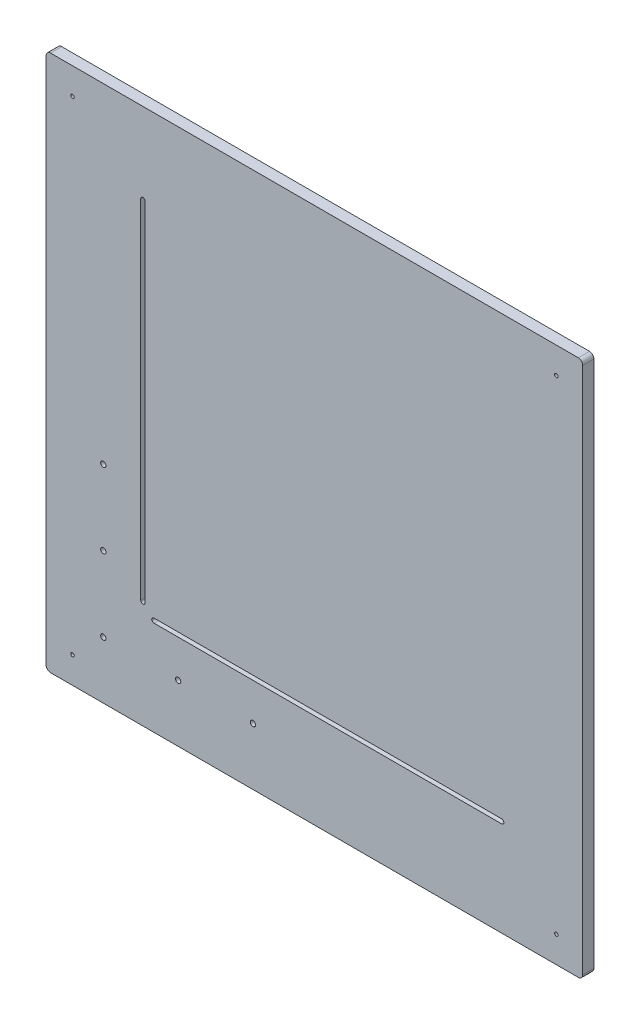
ISO-10303-21;
HEADER;
FILE_DESCRIPTION(('STEP AP214'),'2;1');
FILE_NAME('part.step','',(''),(''),'','','');
FILE_SCHEMA(('AUTOMOTIVE_DESIGN { 1 0 10303 214 1 1 1 1 }'));
ENDSEC;
DATA;
#1=APPLICATION_CONTEXT('core data for automotive mechanical design processes');
#2=APPLICATION_PROTOCOL_DEFINITION('international standard','automotive_design',2000,#1);
#3=PRODUCT_CONTEXT('',#1,'mechanical');
#4=PRODUCT('Part','Part','',(#3));
#5=PRODUCT_RELATED_PRODUCT_CATEGORY('part','',(#4));
#6=PRODUCT_DEFINITION_FORMATION('','',#4);
#7=PRODUCT_DEFINITION_CONTEXT('part definition',#1,'design');
#8=PRODUCT_DEFINITION('design','',#6,#7);
#9=PRODUCT_DEFINITION_SHAPE('','',#8);
#10=(LENGTH_UNIT() NAMED_UNIT(*) SI_UNIT(.MILLI.,.METRE.));
#11=(NAMED_UNIT(*) PLANE_ANGLE_UNIT() SI_UNIT($,.RADIAN.));
#12=(NAMED_UNIT(*) SI_UNIT($,.STERADIAN.) SOLID_ANGLE_UNIT());
#13=UNCERTAINTY_MEASURE_WITH_UNIT(LENGTH_MEASURE(1.E-05),#10,'distance_accuracy_value','');
#14=(GEOMETRIC_REPRESENTATION_CONTEXT(3) GLOBAL_UNCERTAINTY_ASSIGNED_CONTEXT((#13)) GLOBAL_UNIT_ASSIGNED_CONTEXT((#10,
#11,#12)) REPRESENTATION_CONTEXT('',''));
#15=CARTESIAN_POINT('',(0.,0.,0.));
#16=DIRECTION('',(0.,0.,1.));
#17=DIRECTION('',(1.,0.,0.));
#18=AXIS2_PLACEMENT_3D('',#15,#16,#17);
#19=CARTESIAN_POINT('',(0.,0.,0.));
#20=DIRECTION('',(0.,0.,-1.));
#21=DIRECTION('',(-1.,0.,0.));
#22=AXIS2_PLACEMENT_3D('',#19,#20,#21);
#23=PLANE('',#22);
#24=CARTESIAN_POINT('',(-34.9,-119.9,0.));
#25=DIRECTION('',(0.,0.,1.));
#26=DIRECTION('',(1.,0.,0.));
#27=AXIS2_PLACEMENT_3D('',#24,#25,#26);
#28=CIRCLE('',#27,1.5);
#29=CARTESIAN_POINT('',(-33.4,-119.9,0.));
#30=VERTEX_POINT('',#29);
#31=EDGE_CURVE('E746',#30,#30,#28,.T.);
#32=ORIENTED_EDGE('',*,*,#31,.T.);
#33=EDGE_LOOP('',(#32));
#34=FACE_BOUND('',#33,.T.);
#35=CARTESIAN_POINT('',(-77.4,-119.9,0.));
#36=DIRECTION('',(0.,0.,1.));
#37=DIRECTION('',(1.,0.,0.));
#38=AXIS2_PLACEMENT_3D('',#35,#36,#37);
#39=CIRCLE('',#38,1.5);
#40=CARTESIAN_POINT('',(-75.9,-119.9,0.));
#41=VERTEX_POINT('',#40);
#42=EDGE_CURVE('E756',#41,#41,#39,.T.);
#43=ORIENTED_EDGE('',*,*,#42,.T.);
#44=EDGE_LOOP('',(#43));
#45=FACE_BOUND('',#44,.T.);
#46=CARTESIAN_POINT('',(-119.9,-119.9,0.));
#47=DIRECTION('',(0.,0.,1.));
#48=DIRECTION('',(1.,0.,0.));
#49=AXIS2_PLACEMENT_3D('',#46,#47,#48);
#50=CIRCLE('',#49,1.5);
#51=CARTESIAN_POINT('',(-118.4,-119.9,0.));
#52=VERTEX_POINT('',#51);
#53=EDGE_CURVE('E762',#52,#52,#50,.T.);
#54=ORIENTED_EDGE('',*,*,#53,.T.);
#55=EDGE_LOOP('',(#54));
#56=FACE_BOUND('',#55,.T.);
#57=CARTESIAN_POINT('',(-119.9,-77.4,0.));
#58=DIRECTION('',(0.,0.,1.));
#59=DIRECTION('',(1.,0.,0.));
#60=AXIS2_PLACEMENT_3D('',#57,#58,#59);
#61=CIRCLE('',#60,1.5);
#62=CARTESIAN_POINT('',(-118.4,-77.4,0.));
#63=VERTEX_POINT('',#62);
#64=EDGE_CURVE('E768',#63,#63,#61,.T.);
#65=ORIENTED_EDGE('',*,*,#64,.T.);
#66=EDGE_LOOP('',(#65));
#67=FACE_BOUND('',#66,.T.);
#68=CARTESIAN_POINT('',(-119.9,-34.9,0.));
#69=DIRECTION('',(0.,0.,1.));
#70=DIRECTION('',(1.,0.,0.));
#71=AXIS2_PLACEMENT_3D('',#68,#69,#70);
#72=CIRCLE('',#71,1.5);
#73=CARTESIAN_POINT('',(-118.4,-34.9,0.));
#74=VERTEX_POINT('',#73);
#75=EDGE_CURVE('E774',#74,#74,#72,.T.);
#76=ORIENTED_EDGE('',*,*,#75,.T.);
#77=EDGE_LOOP('',(#76));
#78=FACE_BOUND('',#77,.T.);
#79=CARTESIAN_POINT('',(137.4,137.4,0.));
#80=DIRECTION('',(0.,0.,-1.));
#81=DIRECTION('',(-1.,0.,0.));
#82=AXIS2_PLACEMENT_3D('',#79,#80,#81);
#83=CIRCLE('',#82,1.);
#84=CARTESIAN_POINT('',(136.4,137.4,0.));
#85=VERTEX_POINT('',#84);
#86=EDGE_CURVE('E358',#85,#85,#83,.T.);
#87=ORIENTED_EDGE('',*,*,#86,.F.);
#88=EDGE_LOOP('',(#87));
#89=FACE_BOUND('',#88,.T.);
#90=CARTESIAN_POINT('',(-137.4,-137.4,0.));
#91=DIRECTION('',(0.,0.,-1.));
#92=DIRECTION('',(-1.,0.,0.));
#93=AXIS2_PLACEMENT_3D('',#90,#91,#92);
#94=CIRCLE('',#93,1.);
#95=CARTESIAN_POINT('',(-138.4,-137.4,0.));
#96=VERTEX_POINT('',#95);
#97=EDGE_CURVE('E364',#96,#96,#94,.T.);
#98=ORIENTED_EDGE('',*,*,#97,.F.);
#99=EDGE_LOOP('',(#98));
#100=FACE_BOUND('',#99,.T.);
#101=CARTESIAN_POINT('',(137.4,-137.4,0.));
#102=DIRECTION('',(0.,0.,-1.));
#103=DIRECTION('',(-1.,0.,0.));
#104=AXIS2_PLACEMENT_3D('',#101,#102,#103);
#105=CIRCLE('',#104,1.);
#106=CARTESIAN_POINT('',(136.4,-137.4,0.));
#107=VERTEX_POINT('',#106);
#108=EDGE_CURVE('E370',#107,#107,#105,.T.);
#109=ORIENTED_EDGE('',*,*,#108,.F.);
#110=EDGE_LOOP('',(#109));
#111=FACE_BOUND('',#110,.T.);
#112=CARTESIAN_POINT('',(-137.4,137.4,0.));
#113=DIRECTION('',(0.,0.,-1.));
#114=DIRECTION('',(-1.,0.,0.));
#115=AXIS2_PLACEMENT_3D('',#112,#113,#114);
#116=CIRCLE('',#115,1.);
#117=CARTESIAN_POINT('',(-138.4,137.4,0.));
#118=VERTEX_POINT('',#117);
#119=EDGE_CURVE('E376',#118,#118,#116,.T.);
#120=ORIENTED_EDGE('',*,*,#119,.F.);
#121=EDGE_LOOP('',(#120));
#122=FACE_BOUND('',#121,.T.);
#123=DIRECTION('',(-1.,0.,0.));
#124=VECTOR('',#123,1.);
#125=CARTESIAN_POINT('',(-152.4,152.4,0.));
#126=LINE('',#125,#124);
#127=CARTESIAN_POINT('',(149.9,152.4,0.));
#128=VERTEX_POINT('',#127);
#129=CARTESIAN_POINT('',(-149.9,152.4,0.));
#130=VERTEX_POINT('',#129);
#131=EDGE_CURVE('E396',#128,#130,#126,.T.);
#132=ORIENTED_EDGE('',*,*,#131,.F.);
#133=CARTESIAN_POINT('',(149.9,149.9,0.));
#134=DIRECTION('',(0.,0.,-1.));
#135=DIRECTION('',(-1.,0.,0.));
#136=AXIS2_PLACEMENT_3D('',#133,#134,#135);
#137=CIRCLE('',#136,2.5);
#138=CARTESIAN_POINT('',(152.4,149.9,0.));
#139=VERTEX_POINT('',#138);
#140=EDGE_CURVE('E414',#128,#139,#137,.T.);
#141=ORIENTED_EDGE('',*,*,#140,.T.);
#142=DIRECTION('',(0.,1.,0.));
#143=VECTOR('',#142,1.);
#144=CARTESIAN_POINT('',(152.4,-152.4,0.));
#145=LINE('',#144,#143);
#146=CARTESIAN_POINT('',(152.4,-149.9,0.));
#147=VERTEX_POINT('',#146);
#148=EDGE_CURVE('E379',#147,#139,#145,.T.);
#149=ORIENTED_EDGE('',*,*,#148,.F.);
#150=CARTESIAN_POINT('',(149.9,-149.9,0.));
#151=DIRECTION('',(0.,0.,-1.));
#152=DIRECTION('',(-1.,0.,0.));
#153=AXIS2_PLACEMENT_3D('',#150,#151,#152);
#154=CIRCLE('',#153,2.5);
#155=CARTESIAN_POINT('',(149.9,-152.4,0.));
#156=VERTEX_POINT('',#155);
#157=EDGE_CURVE('E412',#147,#156,#154,.T.);
#158=ORIENTED_EDGE('',*,*,#157,.T.);
#159=DIRECTION('',(1.,0.,0.));
#160=VECTOR('',#159,1.);
#161=CARTESIAN_POINT('',(-152.4,-152.4,0.));
#162=LINE('',#161,#160);
#163=CARTESIAN_POINT('',(-149.9,-152.4,0.));
#164=VERTEX_POINT('',#163);
#165=EDGE_CURVE('E384',#164,#156,#162,.T.);
#166=ORIENTED_EDGE('',*,*,#165,.F.);
#167=CARTESIAN_POINT('',(-149.9,-149.9,0.));
#168=DIRECTION('',(0.,0.,-1.));
#169=DIRECTION('',(-1.,0.,0.));
#170=AXIS2_PLACEMENT_3D('',#167,#168,#169);
#171=CIRCLE('',#170,2.5);
#172=CARTESIAN_POINT('',(-152.4,-149.9,0.));
#173=VERTEX_POINT('',#172);
#174=EDGE_CURVE('E410',#164,#173,#171,.T.);
#175=ORIENTED_EDGE('',*,*,#174,.T.);
#176=DIRECTION('',(0.,-1.,0.));
#177=VECTOR('',#176,1.);
#178=CARTESIAN_POINT('',(-152.4,-152.4,0.));
#179=LINE('',#178,#177);
#180=CARTESIAN_POINT('',(-152.4,149.9,0.));
#181=VERTEX_POINT('',#180);
#182=EDGE_CURVE('E399',#181,#173,#179,.T.);
#183=ORIENTED_EDGE('',*,*,#182,.F.);
#184=CARTESIAN_POINT('',(-149.9,149.9,0.));
#185=DIRECTION('',(0.,0.,-1.));
#186=DIRECTION('',(-1.,0.,0.));
#187=AXIS2_PLACEMENT_3D('',#184,#185,#186);
#188=CIRCLE('',#187,2.5);
#189=EDGE_CURVE('E408',#181,#130,#188,.T.);
#190=ORIENTED_EDGE('',*,*,#189,.T.);
#191=EDGE_LOOP('',(#132,#141,#149,#158,#166,#175,#183,#190));
#192=FACE_BOUND('',#191,.T.);
#193=CARTESIAN_POINT('',(-91.15,-97.4,0.));
#194=DIRECTION('',(0.,0.,1.));
#195=DIRECTION('',(1.,0.,0.));
#196=AXIS2_PLACEMENT_3D('',#193,#194,#195);
#197=CIRCLE('',#196,1.25);
#198=CARTESIAN_POINT('',(-91.1499999999999,-96.15,0.));
#199=VERTEX_POINT('',#198);
#200=CARTESIAN_POINT('',(-91.1499999999999,-98.65,0.));
#201=VERTEX_POINT('',#200);
#202=EDGE_CURVE('E336',#199,#201,#197,.T.);
#203=ORIENTED_EDGE('',*,*,#202,.T.);
#204=DIRECTION('',(1.,0.,0.));
#205=VECTOR('',#204,1.);
#206=CARTESIAN_POINT('',(-91.1499999999999,-98.65,0.));
#207=LINE('',#206,#205);
#208=CARTESIAN_POINT('',(106.35,-98.65,0.));
#209=VERTEX_POINT('',#208);
#210=EDGE_CURVE('E325',#201,#209,#207,.T.);
#211=ORIENTED_EDGE('',*,*,#210,.T.);
#212=CARTESIAN_POINT('',(106.35,-97.4,0.));
#213=DIRECTION('',(0.,0.,1.));
#214=DIRECTION('',(1.,0.,0.));
#215=AXIS2_PLACEMENT_3D('',#212,#213,#214);
#216=CIRCLE('',#215,1.25);
#217=CARTESIAN_POINT('',(106.35,-96.15,0.));
#218=VERTEX_POINT('',#217);
#219=EDGE_CURVE('E347',#209,#218,#216,.T.);
#220=ORIENTED_EDGE('',*,*,#219,.T.);
#221=DIRECTION('',(1.,0.,0.));
#222=VECTOR('',#221,1.);
#223=CARTESIAN_POINT('',(-91.1499999999999,-96.15,0.));
#224=LINE('',#223,#222);
#225=EDGE_CURVE('E328',#199,#218,#224,.T.);
#226=ORIENTED_EDGE('',*,*,#225,.F.);
#227=EDGE_LOOP('',(#203,#211,#220,#226));
#228=FACE_BOUND('',#227,.T.);
#229=CARTESIAN_POINT('',(-97.4,106.35,0.));
#230=DIRECTION('',(0.,0.,1.));
#231=DIRECTION('',(1.,0.,0.));
#232=AXIS2_PLACEMENT_3D('',#229,#230,#231);
#233=CIRCLE('',#232,1.25);
#234=CARTESIAN_POINT('',(-96.15,106.35,0.));
#235=VERTEX_POINT('',#234);
#236=CARTESIAN_POINT('',(-98.65,106.35,0.));
#237=VERTEX_POINT('',#236);
#238=EDGE_CURVE('E306',#235,#237,#233,.T.);
#239=ORIENTED_EDGE('',*,*,#238,.T.);
#240=DIRECTION('',(0.,-1.,0.));
#241=VECTOR('',#240,1.);
#242=CARTESIAN_POINT('',(-98.65,106.35,0.));
#243=LINE('',#242,#241);
#244=CARTESIAN_POINT('',(-98.65,-91.15,0.));
#245=VERTEX_POINT('',#244);
#246=EDGE_CURVE('E292',#237,#245,#243,.T.);
#247=ORIENTED_EDGE('',*,*,#246,.T.);
#248=CARTESIAN_POINT('',(-97.4,-91.15,0.));
#249=DIRECTION('',(0.,0.,1.));
#250=DIRECTION('',(1.,0.,0.));
#251=AXIS2_PLACEMENT_3D('',#248,#249,#250);
#252=CIRCLE('',#251,1.25);
#253=CARTESIAN_POINT('',(-96.15,-91.15,0.));
#254=VERTEX_POINT('',#253);
#255=EDGE_CURVE('E320',#245,#254,#252,.T.);
#256=ORIENTED_EDGE('',*,*,#255,.T.);
#257=DIRECTION('',(0.,-1.,0.));
#258=VECTOR('',#257,1.);
#259=CARTESIAN_POINT('',(-96.15,106.35,0.));
#260=LINE('',#259,#258);
#261=EDGE_CURVE('E302',#235,#254,#260,.T.);
#262=ORIENTED_EDGE('',*,*,#261,.F.);
#263=EDGE_LOOP('',(#239,#247,#256,#262));
#264=FACE_BOUND('',#263,.T.);
#265=ADVANCED_FACE('F182',(#34,#45,#56,#67,#78,#89,#100,#111,#122,#192,#228,#264),#23,.T.);
#266=CARTESIAN_POINT('',(0.,0.,6.35));
#267=DIRECTION('',(0.,0.,-1.));
#268=DIRECTION('',(-1.,0.,0.));
#269=AXIS2_PLACEMENT_3D('',#266,#267,#268);
#270=PLANE('',#269);
#271=CARTESIAN_POINT('',(-34.9,-119.9,6.35));
#272=DIRECTION('',(0.,0.,1.));
#273=DIRECTION('',(1.,0.,0.));
#274=AXIS2_PLACEMENT_3D('',#271,#272,#273);
#275=CIRCLE('',#274,1.5);
#276=CARTESIAN_POINT('',(-33.4,-119.9,6.35));
#277=VERTEX_POINT('',#276);
#278=EDGE_CURVE('E749',#277,#277,#275,.T.);
#279=ORIENTED_EDGE('',*,*,#278,.F.);
#280=EDGE_LOOP('',(#279));
#281=FACE_BOUND('',#280,.T.);
#282=CARTESIAN_POINT('',(-77.4,-119.9,6.35));
#283=DIRECTION('',(0.,0.,1.));
#284=DIRECTION('',(1.,0.,0.));
#285=AXIS2_PLACEMENT_3D('',#282,#283,#284);
#286=CIRCLE('',#285,1.5);
#287=CARTESIAN_POINT('',(-75.9,-119.9,6.35));
#288=VERTEX_POINT('',#287);
#289=EDGE_CURVE('E751',#288,#288,#286,.T.);
#290=ORIENTED_EDGE('',*,*,#289,.F.);
#291=EDGE_LOOP('',(#290));
#292=FACE_BOUND('',#291,.T.);
#293=CARTESIAN_POINT('',(-119.9,-119.9,6.35));
#294=DIRECTION('',(0.,0.,1.));
#295=DIRECTION('',(1.,0.,0.));
#296=AXIS2_PLACEMENT_3D('',#293,#294,#295);
#297=CIRCLE('',#296,1.5);
#298=CARTESIAN_POINT('',(-118.4,-119.9,6.35));
#299=VERTEX_POINT('',#298);
#300=EDGE_CURVE('E759',#299,#299,#297,.T.);
#301=ORIENTED_EDGE('',*,*,#300,.F.);
#302=EDGE_LOOP('',(#301));
#303=FACE_BOUND('',#302,.T.);
#304=CARTESIAN_POINT('',(-119.9,-77.4,6.35));
#305=DIRECTION('',(0.,0.,1.));
#306=DIRECTION('',(1.,0.,0.));
#307=AXIS2_PLACEMENT_3D('',#304,#305,#306);
#308=CIRCLE('',#307,1.5);
#309=CARTESIAN_POINT('',(-118.4,-77.4,6.35));
#310=VERTEX_POINT('',#309);
#311=EDGE_CURVE('E765',#310,#310,#308,.T.);
#312=ORIENTED_EDGE('',*,*,#311,.F.);
#313=EDGE_LOOP('',(#312));
#314=FACE_BOUND('',#313,.T.);
#315=CARTESIAN_POINT('',(-119.9,-34.9,6.35));
#316=DIRECTION('',(0.,0.,1.));
#317=DIRECTION('',(1.,0.,0.));
#318=AXIS2_PLACEMENT_3D('',#315,#316,#317);
#319=CIRCLE('',#318,1.5);
#320=CARTESIAN_POINT('',(-118.4,-34.9,6.35));
#321=VERTEX_POINT('',#320);
#322=EDGE_CURVE('E771',#321,#321,#319,.T.);
#323=ORIENTED_EDGE('',*,*,#322,.F.);
#324=EDGE_LOOP('',(#323));
#325=FACE_BOUND('',#324,.T.);
#326=CARTESIAN_POINT('',(-97.4,-91.15,6.35));
#327=DIRECTION('',(0.,0.,1.));
#328=DIRECTION('',(1.,0.,0.));
#329=AXIS2_PLACEMENT_3D('',#326,#327,#328);
#330=CIRCLE('',#329,1.25);
#331=CARTESIAN_POINT('',(-98.65,-91.15,6.35));
#332=VERTEX_POINT('',#331);
#333=CARTESIAN_POINT('',(-96.15,-91.15,6.35));
#334=VERTEX_POINT('',#333);
#335=EDGE_CURVE('E318',#332,#334,#330,.T.);
#336=ORIENTED_EDGE('',*,*,#335,.F.);
#337=DIRECTION('',(0.,-1.,0.));
#338=VECTOR('',#337,1.);
#339=CARTESIAN_POINT('',(-98.65,106.35,6.35));
#340=LINE('',#339,#338);
#341=CARTESIAN_POINT('',(-98.65,106.35,6.35));
#342=VERTEX_POINT('',#341);
#343=EDGE_CURVE('E303',#342,#332,#340,.T.);
#344=ORIENTED_EDGE('',*,*,#343,.F.);
#345=CARTESIAN_POINT('',(-97.4,106.35,6.35));
#346=DIRECTION('',(0.,0.,1.));
#347=DIRECTION('',(1.,0.,0.));
#348=AXIS2_PLACEMENT_3D('',#345,#346,#347);
#349=CIRCLE('',#348,1.25);
#350=CARTESIAN_POINT('',(-96.15,106.35,6.35));
#351=VERTEX_POINT('',#350);
#352=EDGE_CURVE('E309',#351,#342,#349,.T.);
#353=ORIENTED_EDGE('',*,*,#352,.F.);
#354=DIRECTION('',(0.,-1.,0.));
#355=VECTOR('',#354,1.);
#356=CARTESIAN_POINT('',(-96.15,106.35,6.35));
#357=LINE('',#356,#355);
#358=EDGE_CURVE('E779',#351,#334,#357,.T.);
#359=ORIENTED_EDGE('',*,*,#358,.T.);
#360=EDGE_LOOP('',(#336,#344,#353,#359));
#361=FACE_BOUND('',#360,.T.);
#362=CARTESIAN_POINT('',(106.35,-97.4,6.35));
#363=DIRECTION('',(0.,0.,1.));
#364=DIRECTION('',(1.,0.,0.));
#365=AXIS2_PLACEMENT_3D('',#362,#363,#364);
#366=CIRCLE('',#365,1.25);
#367=CARTESIAN_POINT('',(106.35,-98.65,6.35));
#368=VERTEX_POINT('',#367);
#369=CARTESIAN_POINT('',(106.35,-96.15,6.35));
#370=VERTEX_POINT('',#369);
#371=EDGE_CURVE('E344',#368,#370,#366,.T.);
#372=ORIENTED_EDGE('',*,*,#371,.F.);
#373=DIRECTION('',(1.,0.,0.));
#374=VECTOR('',#373,1.);
#375=CARTESIAN_POINT('',(-91.1499999999999,-98.65,6.35));
#376=LINE('',#375,#374);
#377=CARTESIAN_POINT('',(-91.15,-98.65,6.35));
#378=VERTEX_POINT('',#377);
#379=EDGE_CURVE('E323',#378,#368,#376,.T.);
#380=ORIENTED_EDGE('',*,*,#379,.F.);
#381=CARTESIAN_POINT('',(-91.15,-97.4,6.35));
#382=DIRECTION('',(0.,0.,1.));
#383=DIRECTION('',(1.,0.,0.));
#384=AXIS2_PLACEMENT_3D('',#381,#382,#383);
#385=CIRCLE('',#384,1.25);
#386=CARTESIAN_POINT('',(-91.1499999999999,-96.15,6.35));
#387=VERTEX_POINT('',#386);
#388=EDGE_CURVE('E333',#387,#378,#385,.T.);
#389=ORIENTED_EDGE('',*,*,#388,.F.);
#390=DIRECTION('',(1.,0.,0.));
#391=VECTOR('',#390,1.);
#392=CARTESIAN_POINT('',(-91.1499999999999,-96.15,6.35));
#393=LINE('',#392,#391);
#394=EDGE_CURVE('E330',#387,#370,#393,.T.);
#395=ORIENTED_EDGE('',*,*,#394,.T.);
#396=EDGE_LOOP('',(#372,#380,#389,#395));
#397=FACE_BOUND('',#396,.T.);
#398=CARTESIAN_POINT('',(-137.4,-137.4,6.35));
#399=DIRECTION('',(0.,0.,1.));
#400=DIRECTION('',(1.,0.,0.));
#401=AXIS2_PLACEMENT_3D('',#398,#399,#400);
#402=CIRCLE('',#401,1.);
#403=CARTESIAN_POINT('',(-136.4,-137.4,6.35));
#404=VERTEX_POINT('',#403);
#405=EDGE_CURVE('E361',#404,#404,#402,.T.);
#406=ORIENTED_EDGE('',*,*,#405,.F.);
#407=EDGE_LOOP('',(#406));
#408=FACE_BOUND('',#407,.T.);
#409=CARTESIAN_POINT('',(-137.4,137.4,6.35));
#410=DIRECTION('',(0.,0.,1.));
#411=DIRECTION('',(1.,0.,0.));
#412=AXIS2_PLACEMENT_3D('',#409,#410,#411);
#413=CIRCLE('',#412,1.);
#414=CARTESIAN_POINT('',(-136.4,137.4,6.35));
#415=VERTEX_POINT('',#414);
#416=EDGE_CURVE('E373',#415,#415,#413,.T.);
#417=ORIENTED_EDGE('',*,*,#416,.F.);
#418=EDGE_LOOP('',(#417));
#419=FACE_BOUND('',#418,.T.);
#420=DIRECTION('',(0.,1.,0.));
#421=VECTOR('',#420,1.);
#422=CARTESIAN_POINT('',(152.4,-152.4,6.35));
#423=LINE('',#422,#421);
#424=CARTESIAN_POINT('',(152.4,-149.9,6.35));
#425=VERTEX_POINT('',#424);
#426=CARTESIAN_POINT('',(152.4,149.9,6.35));
#427=VERTEX_POINT('',#426);
#428=EDGE_CURVE('E380',#425,#427,#423,.T.);
#429=ORIENTED_EDGE('',*,*,#428,.T.);
#430=CARTESIAN_POINT('',(149.9,149.9,6.35));
#431=DIRECTION('',(0.,0.,-1.));
#432=DIRECTION('',(-1.,0.,0.));
#433=AXIS2_PLACEMENT_3D('',#430,#431,#432);
#434=CIRCLE('',#433,2.5);
#435=CARTESIAN_POINT('',(149.9,152.4,6.35));
#436=VERTEX_POINT('',#435);
#437=EDGE_CURVE('E427',#427,#436,#434,.F.);
#438=ORIENTED_EDGE('',*,*,#437,.T.);
#439=DIRECTION('',(-1.,0.,0.));
#440=VECTOR('',#439,1.);
#441=CARTESIAN_POINT('',(-152.4,152.4,6.35));
#442=LINE('',#441,#440);
#443=CARTESIAN_POINT('',(-149.9,152.4,6.35));
#444=VERTEX_POINT('',#443);
#445=EDGE_CURVE('E383',#436,#444,#442,.T.);
#446=ORIENTED_EDGE('',*,*,#445,.T.);
#447=CARTESIAN_POINT('',(-149.9,149.9,6.35));
#448=DIRECTION('',(0.,0.,-1.));
#449=DIRECTION('',(-1.,0.,0.));
#450=AXIS2_PLACEMENT_3D('',#447,#448,#449);
#451=CIRCLE('',#450,2.5);
#452=CARTESIAN_POINT('',(-152.4,149.9,6.35));
#453=VERTEX_POINT('',#452);
#454=EDGE_CURVE('E421',#444,#453,#451,.F.);
#455=ORIENTED_EDGE('',*,*,#454,.T.);
#456=DIRECTION('',(0.,-1.,0.));
#457=VECTOR('',#456,1.);
#458=CARTESIAN_POINT('',(-152.4,-152.4,6.35));
#459=LINE('',#458,#457);
#460=CARTESIAN_POINT('',(-152.4,-149.9,6.35));
#461=VERTEX_POINT('',#460);
#462=EDGE_CURVE('E387',#453,#461,#459,.T.);
#463=ORIENTED_EDGE('',*,*,#462,.T.);
#464=CARTESIAN_POINT('',(-149.9,-149.9,6.35));
#465=DIRECTION('',(0.,0.,-1.));
#466=DIRECTION('',(-1.,0.,0.));
#467=AXIS2_PLACEMENT_3D('',#464,#465,#466);
#468=CIRCLE('',#467,2.5);
#469=CARTESIAN_POINT('',(-149.9,-152.4,6.35));
#470=VERTEX_POINT('',#469);
#471=EDGE_CURVE('E423',#461,#470,#468,.F.);
#472=ORIENTED_EDGE('',*,*,#471,.T.);
#473=DIRECTION('',(1.,0.,0.));
#474=VECTOR('',#473,1.);
#475=CARTESIAN_POINT('',(-152.4,-152.4,6.35));
#476=LINE('',#475,#474);
#477=CARTESIAN_POINT('',(149.9,-152.4,6.35));
#478=VERTEX_POINT('',#477);
#479=EDGE_CURVE('E390',#470,#478,#476,.T.);
#480=ORIENTED_EDGE('',*,*,#479,.T.);
#481=CARTESIAN_POINT('',(149.9,-149.9,6.35));
#482=DIRECTION('',(0.,0.,-1.));
#483=DIRECTION('',(-1.,0.,0.));
#484=AXIS2_PLACEMENT_3D('',#481,#482,#483);
#485=CIRCLE('',#484,2.5);
#486=EDGE_CURVE('E425',#478,#425,#485,.F.);
#487=ORIENTED_EDGE('',*,*,#486,.T.);
#488=EDGE_LOOP('',(#429,#438,#446,#455,#463,#472,#480,#487));
#489=FACE_BOUND('',#488,.T.);
#490=CARTESIAN_POINT('',(137.4,-137.4,6.35));
#491=DIRECTION('',(0.,0.,1.));
#492=DIRECTION('',(1.,0.,0.));
#493=AXIS2_PLACEMENT_3D('',#490,#491,#492);
#494=CIRCLE('',#493,1.);
#495=CARTESIAN_POINT('',(138.4,-137.4,6.35));
#496=VERTEX_POINT('',#495);
#497=EDGE_CURVE('E367',#496,#496,#494,.T.);
#498=ORIENTED_EDGE('',*,*,#497,.F.);
#499=EDGE_LOOP('',(#498));
#500=FACE_BOUND('',#499,.T.);
#501=CARTESIAN_POINT('',(137.4,137.4,6.35));
#502=DIRECTION('',(0.,0.,1.));
#503=DIRECTION('',(1.,0.,0.));
#504=AXIS2_PLACEMENT_3D('',#501,#502,#503);
#505=CIRCLE('',#504,1.);
#506=CARTESIAN_POINT('',(138.4,137.4,6.35));
#507=VERTEX_POINT('',#506);
#508=EDGE_CURVE('E355',#507,#507,#505,.T.);
#509=ORIENTED_EDGE('',*,*,#508,.F.);
#510=EDGE_LOOP('',(#509));
#511=FACE_BOUND('',#510,.T.);
#512=ADVANCED_FACE('F456',(#281,#292,#303,#314,#325,#361,#397,#408,#419,#489,#500,#511),#270,.F.);
#513=CARTESIAN_POINT('',(152.4,-152.4,6.35));
#514=DIRECTION('',(-1.,0.,0.));
#515=DIRECTION('',(0.,0.,1.));
#516=AXIS2_PLACEMENT_3D('',#513,#514,#515);
#517=PLANE('',#516);
#518=ORIENTED_EDGE('',*,*,#148,.T.);
#519=DIRECTION('',(0.,0.,-1.));
#520=VECTOR('',#519,1.);
#521=CARTESIAN_POINT('',(152.4,149.9,6.35));
#522=LINE('',#521,#520);
#523=EDGE_CURVE('E419',#139,#427,#522,.F.);
#524=ORIENTED_EDGE('',*,*,#523,.T.);
#525=ORIENTED_EDGE('',*,*,#428,.F.);
#526=DIRECTION('',(0.,0.,-1.));
#527=VECTOR('',#526,1.);
#528=CARTESIAN_POINT('',(152.4,-149.9,6.35));
#529=LINE('',#528,#527);
#530=EDGE_CURVE('E416',#425,#147,#529,.T.);
#531=ORIENTED_EDGE('',*,*,#530,.T.);
#532=EDGE_LOOP('',(#518,#524,#525,#531));
#533=FACE_BOUND('',#532,.T.);
#534=ADVANCED_FACE('F464',(#533),#517,.F.);
#535=CARTESIAN_POINT('',(-152.4,152.4,6.35));
#536=DIRECTION('',(0.,-1.,0.));
#537=DIRECTION('',(0.,0.,-1.));
#538=AXIS2_PLACEMENT_3D('',#535,#536,#537);
#539=PLANE('',#538);
#540=ORIENTED_EDGE('',*,*,#445,.F.);
#541=DIRECTION('',(0.,0.,-1.));
#542=VECTOR('',#541,1.);
#543=CARTESIAN_POINT('',(149.9,152.4,6.35));
#544=LINE('',#543,#542);
#545=EDGE_CURVE('E405',#436,#128,#544,.T.);
#546=ORIENTED_EDGE('',*,*,#545,.T.);
#547=ORIENTED_EDGE('',*,*,#131,.T.);
#548=DIRECTION('',(0.,0.,-1.));
#549=VECTOR('',#548,1.);
#550=CARTESIAN_POINT('',(-149.9,152.4,6.35));
#551=LINE('',#550,#549);
#552=EDGE_CURVE('E393',#130,#444,#551,.F.);
#553=ORIENTED_EDGE('',*,*,#552,.T.);
#554=EDGE_LOOP('',(#540,#546,#547,#553));
#555=FACE_BOUND('',#554,.T.);
#556=ADVANCED_FACE('F472',(#555),#539,.F.);
#557=CARTESIAN_POINT('',(-152.4,-152.4,6.35));
#558=DIRECTION('',(1.,0.,0.));
#559=DIRECTION('',(0.,0.,-1.));
#560=AXIS2_PLACEMENT_3D('',#557,#558,#559);
#561=PLANE('',#560);
#562=ORIENTED_EDGE('',*,*,#182,.T.);
#563=DIRECTION('',(0.,0.,-1.));
#564=VECTOR('',#563,1.);
#565=CARTESIAN_POINT('',(-152.4,-149.9,6.35));
#566=LINE('',#565,#564);
#567=EDGE_CURVE('E13',#173,#461,#566,.F.);
#568=ORIENTED_EDGE('',*,*,#567,.T.);
#569=ORIENTED_EDGE('',*,*,#462,.F.);
#570=DIRECTION('',(0.,0.,-1.));
#571=VECTOR('',#570,1.);
#572=CARTESIAN_POINT('',(-152.4,149.9,6.35));
#573=LINE('',#572,#571);
#574=EDGE_CURVE('E190',#453,#181,#573,.T.);
#575=ORIENTED_EDGE('',*,*,#574,.T.);
#576=EDGE_LOOP('',(#562,#568,#569,#575));
#577=FACE_BOUND('',#576,.T.);
#578=ADVANCED_FACE('F438',(#577),#561,.F.);
#579=CARTESIAN_POINT('',(-152.4,-152.4,6.35));
#580=DIRECTION('',(0.,1.,0.));
#581=DIRECTION('',(0.,0.,1.));
#582=AXIS2_PLACEMENT_3D('',#579,#580,#581);
#583=PLANE('',#582);
#584=ORIENTED_EDGE('',*,*,#165,.T.);
#585=DIRECTION('',(0.,0.,-1.));
#586=VECTOR('',#585,1.);
#587=CARTESIAN_POINT('',(149.9,-152.4,6.35));
#588=LINE('',#587,#586);
#589=EDGE_CURVE('E432',#156,#478,#588,.F.);
#590=ORIENTED_EDGE('',*,*,#589,.T.);
#591=ORIENTED_EDGE('',*,*,#479,.F.);
#592=DIRECTION('',(0.,0.,-1.));
#593=VECTOR('',#592,1.);
#594=CARTESIAN_POINT('',(-149.9,-152.4,6.35));
#595=LINE('',#594,#593);
#596=EDGE_CURVE('E429',#470,#164,#595,.T.);
#597=ORIENTED_EDGE('',*,*,#596,.T.);
#598=EDGE_LOOP('',(#584,#590,#591,#597));
#599=FACE_BOUND('',#598,.T.);
#600=ADVANCED_FACE('F452',(#599),#583,.F.);
#601=CARTESIAN_POINT('',(-137.4,137.4,6.35));
#602=DIRECTION('',(0.,0.,1.));
#603=DIRECTION('',(1.,0.,0.));
#604=AXIS2_PLACEMENT_3D('',#601,#602,#603);
#605=CYLINDRICAL_SURFACE('',#604,1.);
#606=ORIENTED_EDGE('',*,*,#416,.T.);
#607=EDGE_LOOP('',(#606));
#608=FACE_BOUND('',#607,.T.);
#609=ORIENTED_EDGE('',*,*,#119,.T.);
#610=EDGE_LOOP('',(#609));
#611=FACE_BOUND('',#610,.T.);
#612=ADVANCED_FACE('F497',(#608,#611),#605,.F.);
#613=CARTESIAN_POINT('',(137.4,-137.4,6.35));
#614=DIRECTION('',(0.,0.,1.));
#615=DIRECTION('',(1.,0.,0.));
#616=AXIS2_PLACEMENT_3D('',#613,#614,#615);
#617=CYLINDRICAL_SURFACE('',#616,1.);
#618=ORIENTED_EDGE('',*,*,#497,.T.);
#619=EDGE_LOOP('',(#618));
#620=FACE_BOUND('',#619,.T.);
#621=ORIENTED_EDGE('',*,*,#108,.T.);
#622=EDGE_LOOP('',(#621));
#623=FACE_BOUND('',#622,.T.);
#624=ADVANCED_FACE('F667',(#620,#623),#617,.F.);
#625=CARTESIAN_POINT('',(-137.4,-137.4,6.35));
#626=DIRECTION('',(0.,0.,1.));
#627=DIRECTION('',(1.,0.,0.));
#628=AXIS2_PLACEMENT_3D('',#625,#626,#627);
#629=CYLINDRICAL_SURFACE('',#628,1.);
#630=ORIENTED_EDGE('',*,*,#405,.T.);
#631=EDGE_LOOP('',(#630));
#632=FACE_BOUND('',#631,.T.);
#633=ORIENTED_EDGE('',*,*,#97,.T.);
#634=EDGE_LOOP('',(#633));
#635=FACE_BOUND('',#634,.T.);
#636=ADVANCED_FACE('F663',(#632,#635),#629,.F.);
#637=CARTESIAN_POINT('',(137.4,137.4,6.35));
#638=DIRECTION('',(0.,0.,1.));
#639=DIRECTION('',(1.,0.,0.));
#640=AXIS2_PLACEMENT_3D('',#637,#638,#639);
#641=CYLINDRICAL_SURFACE('',#640,1.);
#642=ORIENTED_EDGE('',*,*,#508,.T.);
#643=EDGE_LOOP('',(#642));
#644=FACE_BOUND('',#643,.T.);
#645=ORIENTED_EDGE('',*,*,#86,.T.);
#646=EDGE_LOOP('',(#645));
#647=FACE_BOUND('',#646,.T.);
#648=ADVANCED_FACE('F506',(#644,#647),#641,.F.);
#649=CARTESIAN_POINT('',(149.9,149.9,6.35));
#650=DIRECTION('',(0.,0.,-1.));
#651=DIRECTION('',(-1.,0.,0.));
#652=AXIS2_PLACEMENT_3D('',#649,#650,#651);
#653=CYLINDRICAL_SURFACE('',#652,2.5);
#654=ORIENTED_EDGE('',*,*,#437,.F.);
#655=ORIENTED_EDGE('',*,*,#523,.F.);
#656=ORIENTED_EDGE('',*,*,#140,.F.);
#657=ORIENTED_EDGE('',*,*,#545,.F.);
#658=EDGE_LOOP('',(#654,#655,#656,#657));
#659=FACE_BOUND('',#658,.T.);
#660=ADVANCED_FACE('F469',(#659),#653,.T.);
#661=CARTESIAN_POINT('',(149.9,-149.9,6.35));
#662=DIRECTION('',(0.,0.,-1.));
#663=DIRECTION('',(-1.,0.,0.));
#664=AXIS2_PLACEMENT_3D('',#661,#662,#663);
#665=CYLINDRICAL_SURFACE('',#664,2.5);
#666=ORIENTED_EDGE('',*,*,#486,.F.);
#667=ORIENTED_EDGE('',*,*,#589,.F.);
#668=ORIENTED_EDGE('',*,*,#157,.F.);
#669=ORIENTED_EDGE('',*,*,#530,.F.);
#670=EDGE_LOOP('',(#666,#667,#668,#669));
#671=FACE_BOUND('',#670,.T.);
#672=ADVANCED_FACE('F461',(#671),#665,.T.);
#673=CARTESIAN_POINT('',(-149.9,-149.9,6.35));
#674=DIRECTION('',(0.,0.,-1.));
#675=DIRECTION('',(-1.,0.,0.));
#676=AXIS2_PLACEMENT_3D('',#673,#674,#675);
#677=CYLINDRICAL_SURFACE('',#676,2.5);
#678=ORIENTED_EDGE('',*,*,#471,.F.);
#679=ORIENTED_EDGE('',*,*,#567,.F.);
#680=ORIENTED_EDGE('',*,*,#174,.F.);
#681=ORIENTED_EDGE('',*,*,#596,.F.);
#682=EDGE_LOOP('',(#678,#679,#680,#681));
#683=FACE_BOUND('',#682,.T.);
#684=ADVANCED_FACE('F449',(#683),#677,.T.);
#685=CARTESIAN_POINT('',(-149.9,149.9,6.35));
#686=DIRECTION('',(0.,0.,-1.));
#687=DIRECTION('',(-1.,0.,0.));
#688=AXIS2_PLACEMENT_3D('',#685,#686,#687);
#689=CYLINDRICAL_SURFACE('',#688,2.5);
#690=ORIENTED_EDGE('',*,*,#454,.F.);
#691=ORIENTED_EDGE('',*,*,#552,.F.);
#692=ORIENTED_EDGE('',*,*,#189,.F.);
#693=ORIENTED_EDGE('',*,*,#574,.F.);
#694=EDGE_LOOP('',(#690,#691,#692,#693));
#695=FACE_BOUND('',#694,.T.);
#696=ADVANCED_FACE('F184',(#695),#689,.T.);
#697=CARTESIAN_POINT('',(106.35,-97.4,6.35));
#698=DIRECTION('',(0.,0.,1.));
#699=DIRECTION('',(1.,0.,0.));
#700=AXIS2_PLACEMENT_3D('',#697,#698,#699);
#701=CYLINDRICAL_SURFACE('',#700,1.25);
#702=ORIENTED_EDGE('',*,*,#219,.F.);
#703=DIRECTION('',(0.,0.,1.));
#704=VECTOR('',#703,1.);
#705=CARTESIAN_POINT('',(106.35,-98.65,6.35));
#706=LINE('',#705,#704);
#707=EDGE_CURVE('E352',#368,#209,#706,.F.);
#708=ORIENTED_EDGE('',*,*,#707,.F.);
#709=ORIENTED_EDGE('',*,*,#371,.T.);
#710=DIRECTION('',(0.,0.,1.));
#711=VECTOR('',#710,1.);
#712=CARTESIAN_POINT('',(106.35,-96.15,6.35));
#713=LINE('',#712,#711);
#714=EDGE_CURVE('E350',#218,#370,#713,.T.);
#715=ORIENTED_EDGE('',*,*,#714,.F.);
#716=EDGE_LOOP('',(#702,#708,#709,#715));
#717=FACE_BOUND('',#716,.T.);
#718=ADVANCED_FACE('F475',(#717),#701,.F.);
#719=CARTESIAN_POINT('',(-91.15,-97.4,6.35));
#720=DIRECTION('',(0.,0.,1.));
#721=DIRECTION('',(1.,0.,0.));
#722=AXIS2_PLACEMENT_3D('',#719,#720,#721);
#723=CYLINDRICAL_SURFACE('',#722,1.25);
#724=ORIENTED_EDGE('',*,*,#388,.T.);
#725=DIRECTION('',(0.,0.,1.));
#726=VECTOR('',#725,1.);
#727=CARTESIAN_POINT('',(-91.15,-98.65,6.35));
#728=LINE('',#727,#726);
#729=EDGE_CURVE('E339',#201,#378,#728,.T.);
#730=ORIENTED_EDGE('',*,*,#729,.F.);
#731=ORIENTED_EDGE('',*,*,#202,.F.);
#732=DIRECTION('',(0.,0.,1.));
#733=VECTOR('',#732,1.);
#734=CARTESIAN_POINT('',(-91.15,-96.15,6.35));
#735=LINE('',#734,#733);
#736=EDGE_CURVE('E341',#387,#199,#735,.F.);
#737=ORIENTED_EDGE('',*,*,#736,.F.);
#738=EDGE_LOOP('',(#724,#730,#731,#737));
#739=FACE_BOUND('',#738,.T.);
#740=ADVANCED_FACE('F480',(#739),#723,.F.);
#741=CARTESIAN_POINT('',(-91.1499999999999,-96.15,6.35));
#742=DIRECTION('',(0.,1.,0.));
#743=DIRECTION('',(0.,0.,1.));
#744=AXIS2_PLACEMENT_3D('',#741,#742,#743);
#745=PLANE('',#744);
#746=ORIENTED_EDGE('',*,*,#714,.T.);
#747=ORIENTED_EDGE('',*,*,#394,.F.);
#748=ORIENTED_EDGE('',*,*,#736,.T.);
#749=ORIENTED_EDGE('',*,*,#225,.T.);
#750=EDGE_LOOP('',(#746,#747,#748,#749));
#751=FACE_BOUND('',#750,.T.);
#752=ADVANCED_FACE('F536',(#751),#745,.F.);
#753=CARTESIAN_POINT('',(-91.1499999999999,-98.65,6.35));
#754=DIRECTION('',(0.,-1.,0.));
#755=DIRECTION('',(0.,0.,-1.));
#756=AXIS2_PLACEMENT_3D('',#753,#754,#755);
#757=PLANE('',#756);
#758=ORIENTED_EDGE('',*,*,#707,.T.);
#759=ORIENTED_EDGE('',*,*,#210,.F.);
#760=ORIENTED_EDGE('',*,*,#729,.T.);
#761=ORIENTED_EDGE('',*,*,#379,.T.);
#762=EDGE_LOOP('',(#758,#759,#760,#761));
#763=FACE_BOUND('',#762,.T.);
#764=ADVANCED_FACE('F546',(#763),#757,.F.);
#765=CARTESIAN_POINT('',(-97.4,-91.15,6.35));
#766=DIRECTION('',(0.,0.,1.));
#767=DIRECTION('',(1.,0.,0.));
#768=AXIS2_PLACEMENT_3D('',#765,#766,#767);
#769=CYLINDRICAL_SURFACE('',#768,1.25);
#770=ORIENTED_EDGE('',*,*,#335,.T.);
#771=DIRECTION('',(0.,0.,-1.));
#772=VECTOR('',#771,1.);
#773=CARTESIAN_POINT('',(-96.15,-91.15,0.));
#774=LINE('',#773,#772);
#775=EDGE_CURVE('E311',#334,#254,#774,.T.);
#776=ORIENTED_EDGE('',*,*,#775,.T.);
#777=ORIENTED_EDGE('',*,*,#255,.F.);
#778=DIRECTION('',(0.,0.,1.));
#779=VECTOR('',#778,1.);
#780=CARTESIAN_POINT('',(-98.65,-91.15,6.35));
#781=LINE('',#780,#779);
#782=EDGE_CURVE('E297',#332,#245,#781,.F.);
#783=ORIENTED_EDGE('',*,*,#782,.F.);
#784=EDGE_LOOP('',(#770,#776,#777,#783));
#785=FACE_BOUND('',#784,.T.);
#786=ADVANCED_FACE('F556',(#785),#769,.F.);
#787=CARTESIAN_POINT('',(-97.4,106.35,6.35));
#788=DIRECTION('',(0.,0.,1.));
#789=DIRECTION('',(1.,0.,0.));
#790=AXIS2_PLACEMENT_3D('',#787,#788,#789);
#791=CYLINDRICAL_SURFACE('',#790,1.25);
#792=ORIENTED_EDGE('',*,*,#238,.F.);
#793=DIRECTION('',(0.,0.,-1.));
#794=VECTOR('',#793,1.);
#795=CARTESIAN_POINT('',(-96.15,106.35,0.));
#796=LINE('',#795,#794);
#797=EDGE_CURVE('E197',#351,#235,#796,.T.);
#798=ORIENTED_EDGE('',*,*,#797,.F.);
#799=ORIENTED_EDGE('',*,*,#352,.T.);
#800=DIRECTION('',(0.,0.,1.));
#801=VECTOR('',#800,1.);
#802=CARTESIAN_POINT('',(-98.65,106.35,6.35));
#803=LINE('',#802,#801);
#804=EDGE_CURVE('E295',#237,#342,#803,.T.);
#805=ORIENTED_EDGE('',*,*,#804,.F.);
#806=EDGE_LOOP('',(#792,#798,#799,#805));
#807=FACE_BOUND('',#806,.T.);
#808=ADVANCED_FACE('F305',(#807),#791,.F.);
#809=CARTESIAN_POINT('',(-96.15,106.35,0.));
#810=DIRECTION('',(-1.,0.,0.));
#811=DIRECTION('',(0.,0.,1.));
#812=AXIS2_PLACEMENT_3D('',#809,#810,#811);
#813=PLANE('',#812);
#814=ORIENTED_EDGE('',*,*,#775,.F.);
#815=ORIENTED_EDGE('',*,*,#358,.F.);
#816=ORIENTED_EDGE('',*,*,#797,.T.);
#817=ORIENTED_EDGE('',*,*,#261,.T.);
#818=EDGE_LOOP('',(#814,#815,#816,#817));
#819=FACE_BOUND('',#818,.T.);
#820=ADVANCED_FACE('F576',(#819),#813,.T.);
#821=CARTESIAN_POINT('',(-98.65,106.35,6.35));
#822=DIRECTION('',(-1.,0.,0.));
#823=DIRECTION('',(0.,0.,1.));
#824=AXIS2_PLACEMENT_3D('',#821,#822,#823);
#825=PLANE('',#824);
#826=ORIENTED_EDGE('',*,*,#782,.T.);
#827=ORIENTED_EDGE('',*,*,#246,.F.);
#828=ORIENTED_EDGE('',*,*,#804,.T.);
#829=ORIENTED_EDGE('',*,*,#343,.T.);
#830=EDGE_LOOP('',(#826,#827,#828,#829));
#831=FACE_BOUND('',#830,.T.);
#832=ADVANCED_FACE('F294',(#831),#825,.F.);
#833=CARTESIAN_POINT('',(-119.9,-34.9,6.35));
#834=DIRECTION('',(0.,0.,1.));
#835=DIRECTION('',(1.,0.,0.));
#836=AXIS2_PLACEMENT_3D('',#833,#834,#835);
#837=CYLINDRICAL_SURFACE('',#836,1.5);
#838=ORIENTED_EDGE('',*,*,#75,.F.);
#839=EDGE_LOOP('',(#838));
#840=FACE_BOUND('',#839,.T.);
#841=ORIENTED_EDGE('',*,*,#322,.T.);
#842=EDGE_LOOP('',(#841));
#843=FACE_BOUND('',#842,.T.);
#844=ADVANCED_FACE('F592',(#840,#843),#837,.F.);
#845=CARTESIAN_POINT('',(-119.9,-77.4,6.35));
#846=DIRECTION('',(0.,0.,1.));
#847=DIRECTION('',(1.,0.,0.));
#848=AXIS2_PLACEMENT_3D('',#845,#846,#847);
#849=CYLINDRICAL_SURFACE('',#848,1.5);
#850=ORIENTED_EDGE('',*,*,#64,.F.);
#851=EDGE_LOOP('',(#850));
#852=FACE_BOUND('',#851,.T.);
#853=ORIENTED_EDGE('',*,*,#311,.T.);
#854=EDGE_LOOP('',(#853));
#855=FACE_BOUND('',#854,.T.);
#856=ADVANCED_FACE('F615',(#852,#855),#849,.F.);
#857=CARTESIAN_POINT('',(-119.9,-119.9,6.35));
#858=DIRECTION('',(0.,0.,1.));
#859=DIRECTION('',(1.,0.,0.));
#860=AXIS2_PLACEMENT_3D('',#857,#858,#859);
#861=CYLINDRICAL_SURFACE('',#860,1.5);
#862=ORIENTED_EDGE('',*,*,#53,.F.);
#863=EDGE_LOOP('',(#862));
#864=FACE_BOUND('',#863,.T.);
#865=ORIENTED_EDGE('',*,*,#300,.T.);
#866=EDGE_LOOP('',(#865));
#867=FACE_BOUND('',#866,.T.);
#868=ADVANCED_FACE('F625',(#864,#867),#861,.F.);
#869=CARTESIAN_POINT('',(-77.4,-119.9,6.35));
#870=DIRECTION('',(0.,0.,1.));
#871=DIRECTION('',(1.,0.,0.));
#872=AXIS2_PLACEMENT_3D('',#869,#870,#871);
#873=CYLINDRICAL_SURFACE('',#872,1.5);
#874=ORIENTED_EDGE('',*,*,#42,.F.);
#875=EDGE_LOOP('',(#874));
#876=FACE_BOUND('',#875,.T.);
#877=ORIENTED_EDGE('',*,*,#289,.T.);
#878=EDGE_LOOP('',(#877));
#879=FACE_BOUND('',#878,.T.);
#880=ADVANCED_FACE('F635',(#876,#879),#873,.F.);
#881=CARTESIAN_POINT('',(-34.9,-119.9,6.35));
#882=DIRECTION('',(0.,0.,1.));
#883=DIRECTION('',(1.,0.,0.));
#884=AXIS2_PLACEMENT_3D('',#881,#882,#883);
#885=CYLINDRICAL_SURFACE('',#884,1.5);
#886=ORIENTED_EDGE('',*,*,#31,.F.);
#887=EDGE_LOOP('',(#886));
#888=FACE_BOUND('',#887,.T.);
#889=ORIENTED_EDGE('',*,*,#278,.T.);
#890=EDGE_LOOP('',(#889));
#891=FACE_BOUND('',#890,.T.);
#892=ADVANCED_FACE('F645',(#888,#891),#885,.F.);
#893=CLOSED_SHELL('',(#265,#512,#534,#556,#578,#600,#612,#624,#636,#648,#660,#672,#684,#696,
#718,#740,#752,#764,#786,#808,#820,#832,#844,#856,#868,#880,#892));
#894=MANIFOLD_SOLID_BREP('B2',#893);
#895=ADVANCED_BREP_SHAPE_REPRESENTATION('',(#18,#894),#14);
#896=SHAPE_DEFINITION_REPRESENTATION(#9,#895);
ENDSEC;
END-ISO-10303-21;
